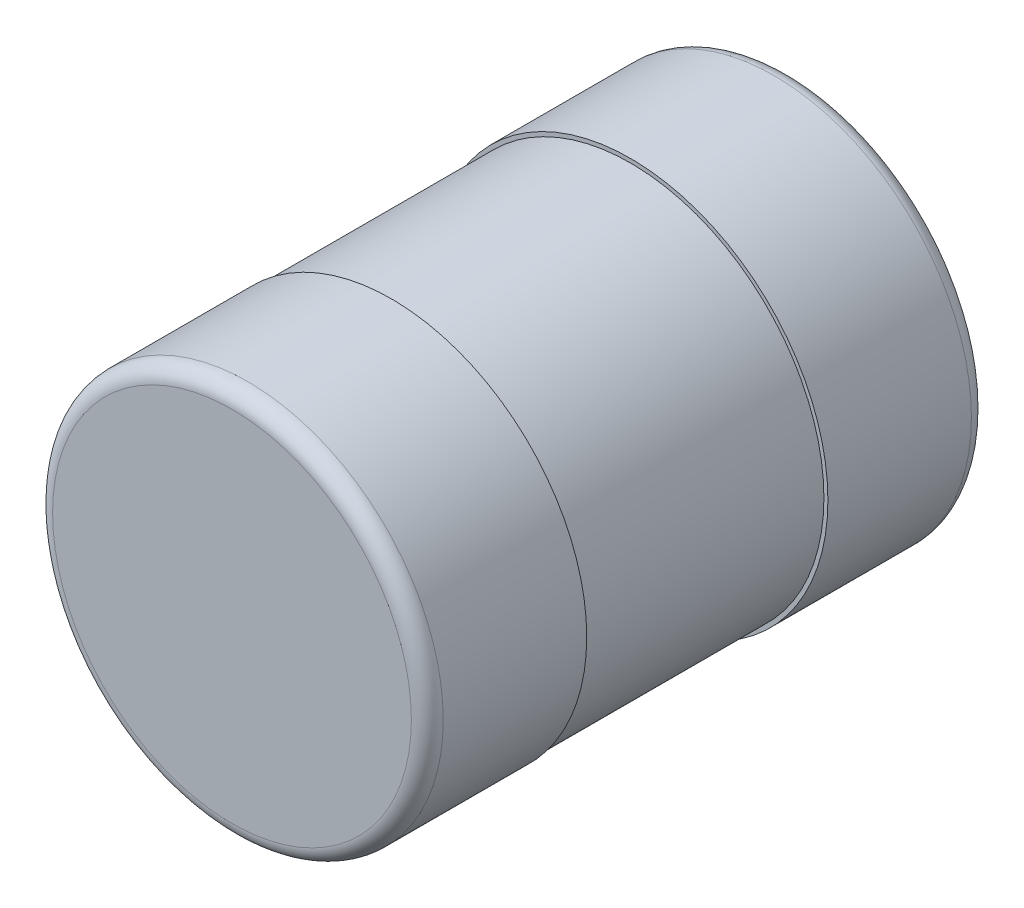
ISO-10303-21;
HEADER;
FILE_DESCRIPTION(('STEP AP214'),'2;1');
FILE_NAME('part.step','',(''),(''),'','','');
FILE_SCHEMA(('AUTOMOTIVE_DESIGN { 1 0 10303 214 1 1 1 1 }'));
ENDSEC;
DATA;
#1=APPLICATION_CONTEXT('core data for automotive mechanical design processes');
#2=APPLICATION_PROTOCOL_DEFINITION('international standard','automotive_design',2000,#1);
#3=PRODUCT_CONTEXT('',#1,'mechanical');
#4=PRODUCT('Part','Part','',(#3));
#5=PRODUCT_RELATED_PRODUCT_CATEGORY('part','',(#4));
#6=PRODUCT_DEFINITION_FORMATION('','',#4);
#7=PRODUCT_DEFINITION_CONTEXT('part definition',#1,'design');
#8=PRODUCT_DEFINITION('design','',#6,#7);
#9=PRODUCT_DEFINITION_SHAPE('','',#8);
#10=(LENGTH_UNIT() NAMED_UNIT(*) SI_UNIT(.MILLI.,.METRE.));
#11=(NAMED_UNIT(*) PLANE_ANGLE_UNIT() SI_UNIT($,.RADIAN.));
#12=(NAMED_UNIT(*) SI_UNIT($,.STERADIAN.) SOLID_ANGLE_UNIT());
#13=UNCERTAINTY_MEASURE_WITH_UNIT(LENGTH_MEASURE(1.E-05),#10,'distance_accuracy_value','');
#14=(GEOMETRIC_REPRESENTATION_CONTEXT(3) GLOBAL_UNCERTAINTY_ASSIGNED_CONTEXT((#13)) GLOBAL_UNIT_ASSIGNED_CONTEXT((#10,
#11,#12)) REPRESENTATION_CONTEXT('',''));
#15=CARTESIAN_POINT('',(0.,0.,0.));
#16=DIRECTION('',(0.,0.,1.));
#17=DIRECTION('',(1.,0.,0.));
#18=AXIS2_PLACEMENT_3D('',#15,#16,#17);
#19=CARTESIAN_POINT('',(0.,0.,2.));
#20=DIRECTION('',(0.,0.,-1.));
#21=DIRECTION('',(-1.,0.,0.));
#22=AXIS2_PLACEMENT_3D('',#19,#20,#21);
#23=CYLINDRICAL_SURFACE('',#22,2.475);
#24=CARTESIAN_POINT('',(0.,0.,0.2));
#25=DIRECTION('',(0.,0.,1.));
#26=DIRECTION('',(1.,0.,0.));
#27=AXIS2_PLACEMENT_3D('',#24,#25,#26);
#28=CIRCLE('',#27,2.475);
#29=CARTESIAN_POINT('',(2.475,0.,0.2));
#30=VERTEX_POINT('',#29);
#31=EDGE_CURVE('E38',#30,#30,#28,.T.);
#32=ORIENTED_EDGE('',*,*,#31,.T.);
#33=EDGE_LOOP('',(#32));
#34=FACE_BOUND('',#33,.T.);
#35=CARTESIAN_POINT('',(0.,0.,2.));
#36=DIRECTION('',(0.,0.,1.));
#37=DIRECTION('',(1.,0.,0.));
#38=AXIS2_PLACEMENT_3D('',#35,#36,#37);
#39=CIRCLE('',#38,2.475);
#40=CARTESIAN_POINT('',(2.475,0.,2.));
#41=VERTEX_POINT('',#40);
#42=EDGE_CURVE('E51',#41,#41,#39,.T.);
#43=ORIENTED_EDGE('',*,*,#42,.F.);
#44=EDGE_LOOP('',(#43));
#45=FACE_BOUND('',#44,.T.);
#46=ADVANCED_FACE('F31',(#34,#45),#23,.T.);
#47=CARTESIAN_POINT('',(0.,0.,2.));
#48=DIRECTION('',(0.,0.,1.));
#49=DIRECTION('',(1.,0.,0.));
#50=AXIS2_PLACEMENT_3D('',#47,#48,#49);
#51=PLANE('',#50);
#52=CARTESIAN_POINT('',(0.,0.,2.));
#53=DIRECTION('',(0.,0.,1.));
#54=DIRECTION('',(1.,0.,0.));
#55=AXIS2_PLACEMENT_3D('',#52,#53,#54);
#56=CIRCLE('',#55,2.425);
#57=CARTESIAN_POINT('',(2.425,0.,2.));
#58=VERTEX_POINT('',#57);
#59=EDGE_CURVE('E55',#58,#58,#56,.T.);
#60=ORIENTED_EDGE('',*,*,#59,.F.);
#61=EDGE_LOOP('',(#60));
#62=FACE_BOUND('',#61,.T.);
#63=ORIENTED_EDGE('',*,*,#42,.T.);
#64=EDGE_LOOP('',(#63));
#65=FACE_BOUND('',#64,.T.);
#66=ADVANCED_FACE('F81',(#62,#65),#51,.T.);
#67=CARTESIAN_POINT('',(0.,0.,0.));
#68=DIRECTION('',(0.,0.,1.));
#69=DIRECTION('',(1.,0.,0.));
#70=AXIS2_PLACEMENT_3D('',#67,#68,#69);
#71=PLANE('',#70);
#72=CARTESIAN_POINT('',(0.,0.,0.));
#73=DIRECTION('',(0.,0.,1.));
#74=DIRECTION('',(1.,0.,0.));
#75=AXIS2_PLACEMENT_3D('',#72,#73,#74);
#76=CIRCLE('',#75,2.275);
#77=CARTESIAN_POINT('',(2.275,0.,0.));
#78=VERTEX_POINT('',#77);
#79=EDGE_CURVE('E10',#78,#78,#76,.F.);
#80=ORIENTED_EDGE('',*,*,#79,.T.);
#81=EDGE_LOOP('',(#80));
#82=FACE_BOUND('',#81,.T.);
#83=ADVANCED_FACE('F86',(#82),#71,.F.);
#84=CARTESIAN_POINT('',(0.,0.,5.));
#85=DIRECTION('',(0.,0.,-1.));
#86=DIRECTION('',(-1.,0.,0.));
#87=AXIS2_PLACEMENT_3D('',#84,#85,#86);
#88=CYLINDRICAL_SURFACE('',#87,2.425);
#89=CARTESIAN_POINT('',(0.,0.,5.));
#90=DIRECTION('',(0.,0.,1.));
#91=DIRECTION('',(1.,0.,0.));
#92=AXIS2_PLACEMENT_3D('',#89,#90,#91);
#93=CIRCLE('',#92,2.425);
#94=CARTESIAN_POINT('',(2.425,0.,5.));
#95=VERTEX_POINT('',#94);
#96=EDGE_CURVE('E54',#95,#95,#93,.T.);
#97=ORIENTED_EDGE('',*,*,#96,.F.);
#98=EDGE_LOOP('',(#97));
#99=FACE_BOUND('',#98,.T.);
#100=ORIENTED_EDGE('',*,*,#59,.T.);
#101=EDGE_LOOP('',(#100));
#102=FACE_BOUND('',#101,.T.);
#103=ADVANCED_FACE('F92',(#99,#102),#88,.T.);
#104=CARTESIAN_POINT('',(0.,0.,7.));
#105=DIRECTION('',(0.,0.,-1.));
#106=DIRECTION('',(-1.,0.,0.));
#107=AXIS2_PLACEMENT_3D('',#104,#105,#106);
#108=CYLINDRICAL_SURFACE('',#107,2.45);
#109=CARTESIAN_POINT('',(0.,0.,6.8));
#110=DIRECTION('',(0.,0.,1.));
#111=DIRECTION('',(1.,0.,0.));
#112=AXIS2_PLACEMENT_3D('',#109,#110,#111);
#113=CIRCLE('',#112,2.45);
#114=CARTESIAN_POINT('',(2.45,0.,6.8));
#115=VERTEX_POINT('',#114);
#116=EDGE_CURVE('E42',#115,#115,#113,.F.);
#117=ORIENTED_EDGE('',*,*,#116,.T.);
#118=EDGE_LOOP('',(#117));
#119=FACE_BOUND('',#118,.T.);
#120=CARTESIAN_POINT('',(0.,0.,5.));
#121=DIRECTION('',(0.,0.,1.));
#122=DIRECTION('',(1.,0.,0.));
#123=AXIS2_PLACEMENT_3D('',#120,#121,#122);
#124=CIRCLE('',#123,2.45);
#125=CARTESIAN_POINT('',(2.45,0.,5.));
#126=VERTEX_POINT('',#125);
#127=EDGE_CURVE('E58',#126,#126,#124,.T.);
#128=ORIENTED_EDGE('',*,*,#127,.T.);
#129=EDGE_LOOP('',(#128));
#130=FACE_BOUND('',#129,.T.);
#131=ADVANCED_FACE('F64',(#119,#130),#108,.T.);
#132=CARTESIAN_POINT('',(0.,0.,7.));
#133=DIRECTION('',(0.,0.,1.));
#134=DIRECTION('',(1.,0.,0.));
#135=AXIS2_PLACEMENT_3D('',#132,#133,#134);
#136=PLANE('',#135);
#137=CARTESIAN_POINT('',(0.,0.,7.));
#138=DIRECTION('',(0.,0.,1.));
#139=DIRECTION('',(1.,0.,0.));
#140=AXIS2_PLACEMENT_3D('',#137,#138,#139);
#141=CIRCLE('',#140,2.25);
#142=CARTESIAN_POINT('',(2.25,0.,7.));
#143=VERTEX_POINT('',#142);
#144=EDGE_CURVE('E46',#143,#143,#141,.T.);
#145=ORIENTED_EDGE('',*,*,#144,.T.);
#146=EDGE_LOOP('',(#145));
#147=FACE_BOUND('',#146,.T.);
#148=ADVANCED_FACE('F69',(#147),#136,.T.);
#149=CARTESIAN_POINT('',(0.,0.,5.));
#150=DIRECTION('',(0.,0.,1.));
#151=DIRECTION('',(1.,0.,0.));
#152=AXIS2_PLACEMENT_3D('',#149,#150,#151);
#153=PLANE('',#152);
#154=ORIENTED_EDGE('',*,*,#96,.T.);
#155=EDGE_LOOP('',(#154));
#156=FACE_BOUND('',#155,.T.);
#157=ORIENTED_EDGE('',*,*,#127,.F.);
#158=EDGE_LOOP('',(#157));
#159=FACE_BOUND('',#158,.T.);
#160=ADVANCED_FACE('F66',(#156,#159),#153,.F.);
#161=CARTESIAN_POINT('',(0.,0.,6.8));
#162=DIRECTION('',(0.,0.,1.));
#163=DIRECTION('',(1.,0.,0.));
#164=AXIS2_PLACEMENT_3D('',#161,#162,#163);
#165=TOROIDAL_SURFACE('',#164,2.25,0.2);
#166=ORIENTED_EDGE('',*,*,#116,.F.);
#167=EDGE_LOOP('',(#166));
#168=FACE_BOUND('',#167,.T.);
#169=ORIENTED_EDGE('',*,*,#144,.F.);
#170=EDGE_LOOP('',(#169));
#171=FACE_BOUND('',#170,.T.);
#172=ADVANCED_FACE('F68',(#168,#171),#165,.T.);
#173=CARTESIAN_POINT('',(0.,0.,0.2));
#174=DIRECTION('',(0.,0.,1.));
#175=DIRECTION('',(1.,0.,0.));
#176=AXIS2_PLACEMENT_3D('',#173,#174,#175);
#177=TOROIDAL_SURFACE('',#176,2.275,0.2);
#178=ORIENTED_EDGE('',*,*,#79,.F.);
#179=EDGE_LOOP('',(#178));
#180=FACE_BOUND('',#179,.T.);
#181=ORIENTED_EDGE('',*,*,#31,.F.);
#182=EDGE_LOOP('',(#181));
#183=FACE_BOUND('',#182,.T.);
#184=ADVANCED_FACE('F33',(#180,#183),#177,.T.);
#185=CLOSED_SHELL('',(#46,#66,#83,#103,#131,#148,#160,#172,#184));
#186=MANIFOLD_SOLID_BREP('B2',#185);
#187=ADVANCED_BREP_SHAPE_REPRESENTATION('',(#18,#186),#14);
#188=SHAPE_DEFINITION_REPRESENTATION(#9,#187);
ENDSEC;
END-ISO-10303-21;
